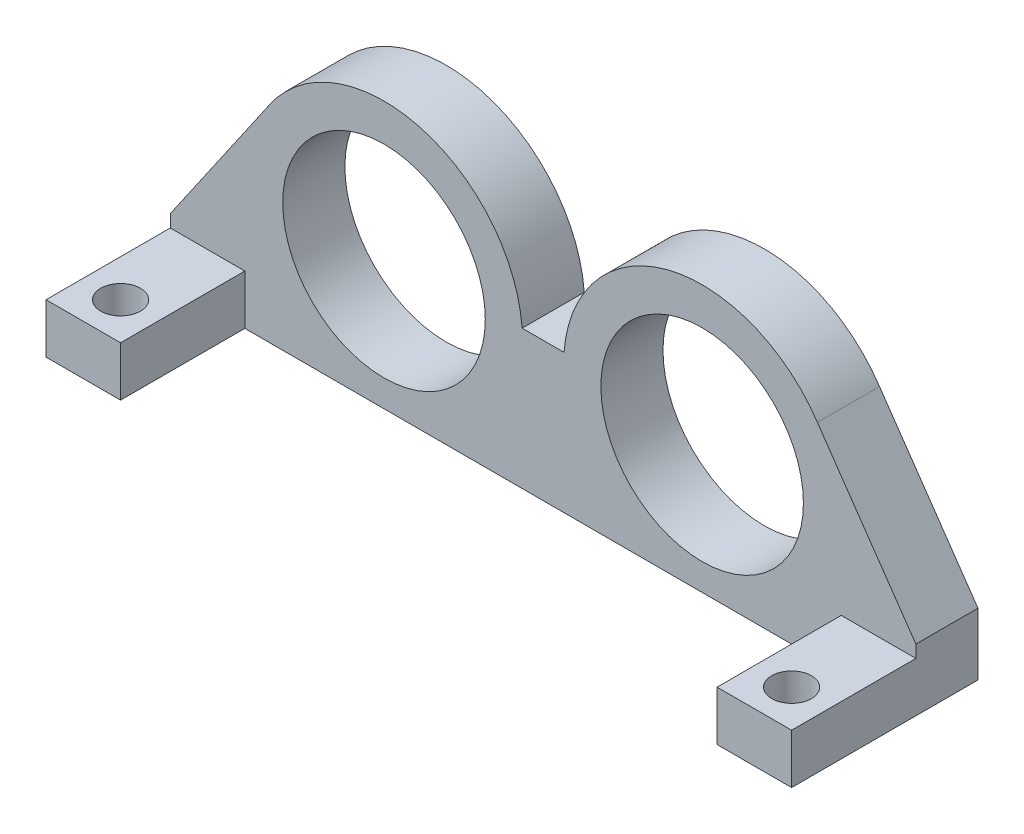
ISO-10303-21;
HEADER;
FILE_DESCRIPTION(('STEP AP214'),'2;1');
FILE_NAME('part.step','',(''),(''),'','','');
FILE_SCHEMA(('AUTOMOTIVE_DESIGN { 1 0 10303 214 1 1 1 1 }'));
ENDSEC;
DATA;
#1=APPLICATION_CONTEXT('core data for automotive mechanical design processes');
#2=APPLICATION_PROTOCOL_DEFINITION('international standard','automotive_design',2000,#1);
#3=PRODUCT_CONTEXT('',#1,'mechanical');
#4=PRODUCT('Part','Part','',(#3));
#5=PRODUCT_RELATED_PRODUCT_CATEGORY('part','',(#4));
#6=PRODUCT_DEFINITION_FORMATION('','',#4);
#7=PRODUCT_DEFINITION_CONTEXT('part definition',#1,'design');
#8=PRODUCT_DEFINITION('design','',#6,#7);
#9=PRODUCT_DEFINITION_SHAPE('','',#8);
#10=(LENGTH_UNIT() NAMED_UNIT(*) SI_UNIT(.MILLI.,.METRE.));
#11=(NAMED_UNIT(*) PLANE_ANGLE_UNIT() SI_UNIT($,.RADIAN.));
#12=(NAMED_UNIT(*) SI_UNIT($,.STERADIAN.) SOLID_ANGLE_UNIT());
#13=UNCERTAINTY_MEASURE_WITH_UNIT(LENGTH_MEASURE(1.E-05),#10,'distance_accuracy_value','');
#14=(GEOMETRIC_REPRESENTATION_CONTEXT(3) GLOBAL_UNCERTAINTY_ASSIGNED_CONTEXT((#13)) GLOBAL_UNIT_ASSIGNED_CONTEXT((#10,
#11,#12)) REPRESENTATION_CONTEXT('',''));
#15=CARTESIAN_POINT('',(0.,0.,0.));
#16=DIRECTION('',(0.,0.,1.));
#17=DIRECTION('',(1.,0.,0.));
#18=AXIS2_PLACEMENT_3D('',#15,#16,#17);
#19=CARTESIAN_POINT('',(-12.8,10.2990572190135,5.));
#20=DIRECTION('',(0.,0.,-1.));
#21=DIRECTION('',(-1.,0.,0.));
#22=AXIS2_PLACEMENT_3D('',#19,#20,#21);
#23=PLANE('',#22);
#24=CARTESIAN_POINT('',(-12.8,10.2990572190135,5.));
#25=DIRECTION('',(0.,0.,1.));
#26=DIRECTION('',(1.,0.,0.));
#27=AXIS2_PLACEMENT_3D('',#24,#25,#26);
#28=CIRCLE('',#27,8.15);
#29=CARTESIAN_POINT('',(-4.65,10.2990572190135,5.));
#30=VERTEX_POINT('',#29);
#31=EDGE_CURVE('E205',#30,#30,#28,.T.);
#32=ORIENTED_EDGE('',*,*,#31,.F.);
#33=EDGE_LOOP('',(#32));
#34=FACE_BOUND('',#33,.T.);
#35=CARTESIAN_POINT('',(12.8,10.2990572190135,5.));
#36=DIRECTION('',(0.,0.,1.));
#37=DIRECTION('',(-1.,0.,0.));
#38=AXIS2_PLACEMENT_3D('',#35,#36,#37);
#39=CIRCLE('',#38,8.15);
#40=CARTESIAN_POINT('',(4.65,10.2990572190135,5.));
#41=VERTEX_POINT('',#40);
#42=EDGE_CURVE('E199',#41,#41,#39,.T.);
#43=ORIENTED_EDGE('',*,*,#42,.F.);
#44=EDGE_LOOP('',(#43));
#45=FACE_BOUND('',#44,.T.);
#46=DIRECTION('',(-1.,0.,0.));
#47=VECTOR('',#46,1.);
#48=CARTESIAN_POINT('',(30.,4.,5.));
#49=LINE('',#48,#47);
#50=CARTESIAN_POINT('',(30.,4.,5.));
#51=VERTEX_POINT('',#50);
#52=CARTESIAN_POINT('',(24.,4.,5.));
#53=VERTEX_POINT('',#52);
#54=EDGE_CURVE('E159',#51,#53,#49,.T.);
#55=ORIENTED_EDGE('',*,*,#54,.F.);
#56=DIRECTION('',(0.,1.,0.));
#57=VECTOR('',#56,1.);
#58=CARTESIAN_POINT('',(30.,0.,5.));
#59=LINE('',#58,#57);
#60=CARTESIAN_POINT('',(30.,5.,5.));
#61=VERTEX_POINT('',#60);
#62=EDGE_CURVE('E215',#51,#61,#59,.T.);
#63=ORIENTED_EDGE('',*,*,#62,.T.);
#64=DIRECTION('',(-0.56786014343892,0.823125055804724,0.));
#65=VECTOR('',#64,1.);
#66=CARTESIAN_POINT('',(30.,5.,5.));
#67=LINE('',#66,#65);
#68=CARTESIAN_POINT('',(22.0760551043822,16.4859224753824,5.));
#69=VERTEX_POINT('',#68);
#70=EDGE_CURVE('E217',#61,#69,#67,.T.);
#71=ORIENTED_EDGE('',*,*,#70,.T.);
#72=CARTESIAN_POINT('',(12.8,10.2990572190135,5.));
#73=DIRECTION('',(0.,0.,1.));
#74=DIRECTION('',(1.,0.,0.));
#75=AXIS2_PLACEMENT_3D('',#72,#73,#74);
#76=CIRCLE('',#75,11.15);
#77=CARTESIAN_POINT('',(1.68444229891298,11.1747723518079,5.));
#78=VERTEX_POINT('',#77);
#79=EDGE_CURVE('E219',#69,#78,#76,.T.);
#80=ORIENTED_EDGE('',*,*,#79,.T.);
#81=DIRECTION('',(-1.,0.,0.));
#82=VECTOR('',#81,1.);
#83=CARTESIAN_POINT('',(-1.68444229891298,11.1747723518079,5.));
#84=LINE('',#83,#82);
#85=CARTESIAN_POINT('',(-1.68444229891298,11.1747723518079,5.));
#86=VERTEX_POINT('',#85);
#87=EDGE_CURVE('E221',#78,#86,#84,.T.);
#88=ORIENTED_EDGE('',*,*,#87,.T.);
#89=CARTESIAN_POINT('',(-12.8,10.2990572190135,5.));
#90=DIRECTION('',(0.,0.,1.));
#91=DIRECTION('',(-1.,0.,0.));
#92=AXIS2_PLACEMENT_3D('',#89,#90,#91);
#93=CIRCLE('',#92,11.15);
#94=CARTESIAN_POINT('',(-22.0760551043822,16.4859224753824,5.));
#95=VERTEX_POINT('',#94);
#96=EDGE_CURVE('E223',#86,#95,#93,.T.);
#97=ORIENTED_EDGE('',*,*,#96,.T.);
#98=DIRECTION('',(-0.56786014343892,-0.823125055804724,0.));
#99=VECTOR('',#98,1.);
#100=CARTESIAN_POINT('',(-30.,4.99999999999999,5.));
#101=LINE('',#100,#99);
#102=CARTESIAN_POINT('',(-30.,4.99999999999999,5.));
#103=VERTEX_POINT('',#102);
#104=EDGE_CURVE('E225',#95,#103,#101,.T.);
#105=ORIENTED_EDGE('',*,*,#104,.T.);
#106=DIRECTION('',(0.,-1.,0.));
#107=VECTOR('',#106,1.);
#108=CARTESIAN_POINT('',(-30.,0.,5.));
#109=LINE('',#108,#107);
#110=CARTESIAN_POINT('',(-30.,3.99999999999999,5.));
#111=VERTEX_POINT('',#110);
#112=EDGE_CURVE('E211',#103,#111,#109,.T.);
#113=ORIENTED_EDGE('',*,*,#112,.T.);
#114=DIRECTION('',(-1.,0.,0.));
#115=VECTOR('',#114,1.);
#116=CARTESIAN_POINT('',(-30.,3.99999999999999,5.));
#117=LINE('',#116,#115);
#118=CARTESIAN_POINT('',(-24.,3.99999999999999,5.));
#119=VERTEX_POINT('',#118);
#120=EDGE_CURVE('E179',#119,#111,#117,.T.);
#121=ORIENTED_EDGE('',*,*,#120,.F.);
#122=DIRECTION('',(0.,1.,0.));
#123=VECTOR('',#122,1.);
#124=CARTESIAN_POINT('',(-24.,0.,5.));
#125=LINE('',#124,#123);
#126=CARTESIAN_POINT('',(-24.,0.,5.));
#127=VERTEX_POINT('',#126);
#128=EDGE_CURVE('E174',#127,#119,#125,.T.);
#129=ORIENTED_EDGE('',*,*,#128,.F.);
#130=DIRECTION('',(1.,0.,0.));
#131=VECTOR('',#130,1.);
#132=CARTESIAN_POINT('',(30.,0.,5.));
#133=LINE('',#132,#131);
#134=CARTESIAN_POINT('',(24.,0.,5.));
#135=VERTEX_POINT('',#134);
#136=EDGE_CURVE('E56',#127,#135,#133,.T.);
#137=ORIENTED_EDGE('',*,*,#136,.T.);
#138=DIRECTION('',(0.,-1.,0.));
#139=VECTOR('',#138,1.);
#140=CARTESIAN_POINT('',(24.,0.,5.));
#141=LINE('',#140,#139);
#142=EDGE_CURVE('E51',#53,#135,#141,.T.);
#143=ORIENTED_EDGE('',*,*,#142,.F.);
#144=EDGE_LOOP('',(#55,#63,#71,#80,#88,#97,#105,#113,#121,#129,#137,#143));
#145=FACE_BOUND('',#144,.T.);
#146=ADVANCED_FACE('F36',(#34,#45,#145),#23,.F.);
#147=CARTESIAN_POINT('',(-12.8,10.2990572190135,0.));
#148=DIRECTION('',(0.,0.,-1.));
#149=DIRECTION('',(-1.,0.,0.));
#150=AXIS2_PLACEMENT_3D('',#147,#148,#149);
#151=PLANE('',#150);
#152=CARTESIAN_POINT('',(-12.8,10.2990572190135,0.));
#153=DIRECTION('',(0.,0.,1.));
#154=DIRECTION('',(1.,0.,0.));
#155=AXIS2_PLACEMENT_3D('',#152,#153,#154);
#156=CIRCLE('',#155,8.15);
#157=CARTESIAN_POINT('',(-4.65,10.2990572190135,0.));
#158=VERTEX_POINT('',#157);
#159=EDGE_CURVE('E202',#158,#158,#156,.T.);
#160=ORIENTED_EDGE('',*,*,#159,.T.);
#161=EDGE_LOOP('',(#160));
#162=FACE_BOUND('',#161,.T.);
#163=DIRECTION('',(0.,-1.,0.));
#164=VECTOR('',#163,1.);
#165=CARTESIAN_POINT('',(-30.,0.,0.));
#166=LINE('',#165,#164);
#167=CARTESIAN_POINT('',(-30.,4.99999999999999,0.));
#168=VERTEX_POINT('',#167);
#169=CARTESIAN_POINT('',(-30.,0.,0.));
#170=VERTEX_POINT('',#169);
#171=EDGE_CURVE('E208',#168,#170,#166,.T.);
#172=ORIENTED_EDGE('',*,*,#171,.F.);
#173=DIRECTION('',(-0.56786014343892,-0.823125055804724,0.));
#174=VECTOR('',#173,1.);
#175=CARTESIAN_POINT('',(-30.,4.99999999999999,0.));
#176=LINE('',#175,#174);
#177=CARTESIAN_POINT('',(-22.0760551043822,16.4859224753824,0.));
#178=VERTEX_POINT('',#177);
#179=EDGE_CURVE('E213',#178,#168,#176,.T.);
#180=ORIENTED_EDGE('',*,*,#179,.F.);
#181=CARTESIAN_POINT('',(-12.8,10.2990572190135,0.));
#182=DIRECTION('',(0.,0.,1.));
#183=DIRECTION('',(-1.,0.,0.));
#184=AXIS2_PLACEMENT_3D('',#181,#182,#183);
#185=CIRCLE('',#184,11.15);
#186=CARTESIAN_POINT('',(-1.68444229891298,11.1747723518079,0.));
#187=VERTEX_POINT('',#186);
#188=EDGE_CURVE('E239',#187,#178,#185,.T.);
#189=ORIENTED_EDGE('',*,*,#188,.F.);
#190=DIRECTION('',(-1.,0.,0.));
#191=VECTOR('',#190,1.);
#192=CARTESIAN_POINT('',(-1.68444229891298,11.1747723518079,0.));
#193=LINE('',#192,#191);
#194=CARTESIAN_POINT('',(1.68444229891298,11.1747723518079,0.));
#195=VERTEX_POINT('',#194);
#196=EDGE_CURVE('E237',#195,#187,#193,.T.);
#197=ORIENTED_EDGE('',*,*,#196,.F.);
#198=CARTESIAN_POINT('',(12.8,10.2990572190135,0.));
#199=DIRECTION('',(0.,0.,1.));
#200=DIRECTION('',(1.,0.,0.));
#201=AXIS2_PLACEMENT_3D('',#198,#199,#200);
#202=CIRCLE('',#201,11.15);
#203=CARTESIAN_POINT('',(22.0760551043822,16.4859224753824,0.));
#204=VERTEX_POINT('',#203);
#205=EDGE_CURVE('E235',#204,#195,#202,.T.);
#206=ORIENTED_EDGE('',*,*,#205,.F.);
#207=DIRECTION('',(-0.56786014343892,0.823125055804724,0.));
#208=VECTOR('',#207,1.);
#209=CARTESIAN_POINT('',(30.,5.,0.));
#210=LINE('',#209,#208);
#211=CARTESIAN_POINT('',(30.,5.,0.));
#212=VERTEX_POINT('',#211);
#213=EDGE_CURVE('E233',#212,#204,#210,.T.);
#214=ORIENTED_EDGE('',*,*,#213,.F.);
#215=DIRECTION('',(0.,1.,0.));
#216=VECTOR('',#215,1.);
#217=CARTESIAN_POINT('',(30.,0.,0.));
#218=LINE('',#217,#216);
#219=CARTESIAN_POINT('',(30.,0.,0.));
#220=VERTEX_POINT('',#219);
#221=EDGE_CURVE('E231',#220,#212,#218,.T.);
#222=ORIENTED_EDGE('',*,*,#221,.F.);
#223=DIRECTION('',(1.,0.,0.));
#224=VECTOR('',#223,1.);
#225=CARTESIAN_POINT('',(30.,0.,0.));
#226=LINE('',#225,#224);
#227=EDGE_CURVE('E141',#170,#220,#226,.T.);
#228=ORIENTED_EDGE('',*,*,#227,.F.);
#229=EDGE_LOOP('',(#172,#180,#189,#197,#206,#214,#222,#228));
#230=FACE_BOUND('',#229,.T.);
#231=CARTESIAN_POINT('',(12.8,10.2990572190135,0.));
#232=DIRECTION('',(0.,0.,1.));
#233=DIRECTION('',(-1.,0.,0.));
#234=AXIS2_PLACEMENT_3D('',#231,#232,#233);
#235=CIRCLE('',#234,8.15);
#236=CARTESIAN_POINT('',(4.65,10.2990572190135,0.));
#237=VERTEX_POINT('',#236);
#238=EDGE_CURVE('E198',#237,#237,#235,.T.);
#239=ORIENTED_EDGE('',*,*,#238,.T.);
#240=EDGE_LOOP('',(#239));
#241=FACE_BOUND('',#240,.T.);
#242=ADVANCED_FACE('F266',(#162,#230,#241),#151,.T.);
#243=CARTESIAN_POINT('',(-30.,0.,5.));
#244=DIRECTION('',(1.,0.,0.));
#245=DIRECTION('',(0.,1.,0.));
#246=AXIS2_PLACEMENT_3D('',#243,#244,#245);
#247=PLANE('',#246);
#248=ORIENTED_EDGE('',*,*,#171,.T.);
#249=DIRECTION('',(0.,0.,-1.));
#250=VECTOR('',#249,1.);
#251=CARTESIAN_POINT('',(-30.,0.,5.));
#252=LINE('',#251,#250);
#253=CARTESIAN_POINT('',(-30.,0.,15.));
#254=VERTEX_POINT('',#253);
#255=EDGE_CURVE('E11',#254,#170,#252,.T.);
#256=ORIENTED_EDGE('',*,*,#255,.F.);
#257=DIRECTION('',(0.,-1.,0.));
#258=VECTOR('',#257,1.);
#259=CARTESIAN_POINT('',(-30.,0.,15.));
#260=LINE('',#259,#258);
#261=CARTESIAN_POINT('',(-30.,3.99999999999999,15.));
#262=VERTEX_POINT('',#261);
#263=EDGE_CURVE('E175',#262,#254,#260,.T.);
#264=ORIENTED_EDGE('',*,*,#263,.F.);
#265=DIRECTION('',(0.,0.,-1.));
#266=VECTOR('',#265,1.);
#267=CARTESIAN_POINT('',(-30.,3.99999999999999,15.));
#268=LINE('',#267,#266);
#269=EDGE_CURVE('E185',#262,#111,#268,.T.);
#270=ORIENTED_EDGE('',*,*,#269,.T.);
#271=ORIENTED_EDGE('',*,*,#112,.F.);
#272=DIRECTION('',(0.,0.,-1.));
#273=VECTOR('',#272,1.);
#274=CARTESIAN_POINT('',(-30.,4.99999999999999,5.));
#275=LINE('',#274,#273);
#276=EDGE_CURVE('E227',#103,#168,#275,.T.);
#277=ORIENTED_EDGE('',*,*,#276,.T.);
#278=EDGE_LOOP('',(#248,#256,#264,#270,#271,#277));
#279=FACE_BOUND('',#278,.T.);
#280=ADVANCED_FACE('F38',(#279),#247,.F.);
#281=CARTESIAN_POINT('',(30.,0.,5.));
#282=DIRECTION('',(0.,1.,0.));
#283=DIRECTION('',(-1.,0.,0.));
#284=AXIS2_PLACEMENT_3D('',#281,#282,#283);
#285=PLANE('',#284);
#286=CARTESIAN_POINT('',(-27.,0.,12.));
#287=DIRECTION('',(0.,1.,0.));
#288=DIRECTION('',(-1.,0.,0.));
#289=AXIS2_PLACEMENT_3D('',#286,#287,#288);
#290=CIRCLE('',#289,1.6);
#291=CARTESIAN_POINT('',(-28.6,0.,12.));
#292=VERTEX_POINT('',#291);
#293=EDGE_CURVE('E162',#292,#292,#290,.T.);
#294=ORIENTED_EDGE('',*,*,#293,.T.);
#295=EDGE_LOOP('',(#294));
#296=FACE_BOUND('',#295,.T.);
#297=CARTESIAN_POINT('',(27.,0.,12.));
#298=DIRECTION('',(0.,1.,0.));
#299=DIRECTION('',(-1.,0.,0.));
#300=AXIS2_PLACEMENT_3D('',#297,#298,#299);
#301=CIRCLE('',#300,1.6);
#302=CARTESIAN_POINT('',(25.4,0.,12.));
#303=VERTEX_POINT('',#302);
#304=EDGE_CURVE('E363',#303,#303,#301,.T.);
#305=ORIENTED_EDGE('',*,*,#304,.T.);
#306=EDGE_LOOP('',(#305));
#307=FACE_BOUND('',#306,.T.);
#308=ORIENTED_EDGE('',*,*,#227,.T.);
#309=DIRECTION('',(0.,0.,-1.));
#310=VECTOR('',#309,1.);
#311=CARTESIAN_POINT('',(30.,0.,5.));
#312=LINE('',#311,#310);
#313=CARTESIAN_POINT('',(30.,0.,15.));
#314=VERTEX_POINT('',#313);
#315=EDGE_CURVE('E44',#314,#220,#312,.T.);
#316=ORIENTED_EDGE('',*,*,#315,.F.);
#317=DIRECTION('',(1.,0.,0.));
#318=VECTOR('',#317,1.);
#319=CARTESIAN_POINT('',(30.,0.,15.));
#320=LINE('',#319,#318);
#321=CARTESIAN_POINT('',(24.,0.,15.));
#322=VERTEX_POINT('',#321);
#323=EDGE_CURVE('E140',#322,#314,#320,.T.);
#324=ORIENTED_EDGE('',*,*,#323,.F.);
#325=DIRECTION('',(0.,0.,-1.));
#326=VECTOR('',#325,1.);
#327=CARTESIAN_POINT('',(24.,0.,15.));
#328=LINE('',#327,#326);
#329=EDGE_CURVE('E167',#322,#135,#328,.T.);
#330=ORIENTED_EDGE('',*,*,#329,.T.);
#331=ORIENTED_EDGE('',*,*,#136,.F.);
#332=DIRECTION('',(0.,0.,-1.));
#333=VECTOR('',#332,1.);
#334=CARTESIAN_POINT('',(-24.,0.,15.));
#335=LINE('',#334,#333);
#336=CARTESIAN_POINT('',(-24.,0.,15.));
#337=VERTEX_POINT('',#336);
#338=EDGE_CURVE('E195',#337,#127,#335,.T.);
#339=ORIENTED_EDGE('',*,*,#338,.F.);
#340=DIRECTION('',(1.,0.,0.));
#341=VECTOR('',#340,1.);
#342=CARTESIAN_POINT('',(-30.,0.,15.));
#343=LINE('',#342,#341);
#344=EDGE_CURVE('E178',#254,#337,#343,.T.);
#345=ORIENTED_EDGE('',*,*,#344,.F.);
#346=ORIENTED_EDGE('',*,*,#255,.T.);
#347=EDGE_LOOP('',(#308,#316,#324,#330,#331,#339,#345,#346));
#348=FACE_BOUND('',#347,.T.);
#349=ADVANCED_FACE('F137',(#296,#307,#348),#285,.F.);
#350=CARTESIAN_POINT('',(30.,0.,5.));
#351=DIRECTION('',(-1.,0.,0.));
#352=DIRECTION('',(0.,-1.,0.));
#353=AXIS2_PLACEMENT_3D('',#350,#351,#352);
#354=PLANE('',#353);
#355=ORIENTED_EDGE('',*,*,#221,.T.);
#356=DIRECTION('',(0.,0.,-1.));
#357=VECTOR('',#356,1.);
#358=CARTESIAN_POINT('',(30.,5.,5.));
#359=LINE('',#358,#357);
#360=EDGE_CURVE('E144',#61,#212,#359,.T.);
#361=ORIENTED_EDGE('',*,*,#360,.F.);
#362=ORIENTED_EDGE('',*,*,#62,.F.);
#363=DIRECTION('',(0.,0.,-1.));
#364=VECTOR('',#363,1.);
#365=CARTESIAN_POINT('',(30.,4.,15.));
#366=LINE('',#365,#364);
#367=CARTESIAN_POINT('',(30.,4.,15.));
#368=VERTEX_POINT('',#367);
#369=EDGE_CURVE('E149',#368,#51,#366,.T.);
#370=ORIENTED_EDGE('',*,*,#369,.F.);
#371=DIRECTION('',(0.,1.,0.));
#372=VECTOR('',#371,1.);
#373=CARTESIAN_POINT('',(30.,0.,15.));
#374=LINE('',#373,#372);
#375=EDGE_CURVE('E146',#314,#368,#374,.T.);
#376=ORIENTED_EDGE('',*,*,#375,.F.);
#377=ORIENTED_EDGE('',*,*,#315,.T.);
#378=EDGE_LOOP('',(#355,#361,#362,#370,#376,#377));
#379=FACE_BOUND('',#378,.T.);
#380=ADVANCED_FACE('F147',(#379),#354,.F.);
#381=CARTESIAN_POINT('',(30.,5.,5.));
#382=DIRECTION('',(-0.823125055804724,-0.56786014343892,0.));
#383=DIRECTION('',(0.56786014343892,-0.823125055804724,0.));
#384=AXIS2_PLACEMENT_3D('',#381,#382,#383);
#385=PLANE('',#384);
#386=ORIENTED_EDGE('',*,*,#213,.T.);
#387=DIRECTION('',(0.,0.,-1.));
#388=VECTOR('',#387,1.);
#389=CARTESIAN_POINT('',(22.0760551043822,16.4859224753824,5.));
#390=LINE('',#389,#388);
#391=EDGE_CURVE('E253',#69,#204,#390,.T.);
#392=ORIENTED_EDGE('',*,*,#391,.F.);
#393=ORIENTED_EDGE('',*,*,#70,.F.);
#394=ORIENTED_EDGE('',*,*,#360,.T.);
#395=EDGE_LOOP('',(#386,#392,#393,#394));
#396=FACE_BOUND('',#395,.T.);
#397=ADVANCED_FACE('F261',(#396),#385,.F.);
#398=CARTESIAN_POINT('',(12.8,10.2990572190135,5.));
#399=DIRECTION('',(0.,0.,-1.));
#400=DIRECTION('',(-1.,0.,0.));
#401=AXIS2_PLACEMENT_3D('',#398,#399,#400);
#402=CYLINDRICAL_SURFACE('',#401,11.15);
#403=ORIENTED_EDGE('',*,*,#205,.T.);
#404=DIRECTION('',(0.,0.,-1.));
#405=VECTOR('',#404,1.);
#406=CARTESIAN_POINT('',(1.68444229891298,11.1747723518079,5.));
#407=LINE('',#406,#405);
#408=EDGE_CURVE('E250',#78,#195,#407,.T.);
#409=ORIENTED_EDGE('',*,*,#408,.F.);
#410=ORIENTED_EDGE('',*,*,#79,.F.);
#411=ORIENTED_EDGE('',*,*,#391,.T.);
#412=EDGE_LOOP('',(#403,#409,#410,#411));
#413=FACE_BOUND('',#412,.T.);
#414=ADVANCED_FACE('F272',(#413),#402,.T.);
#415=CARTESIAN_POINT('',(-1.68444229891298,11.1747723518079,5.));
#416=DIRECTION('',(0.,-1.,0.));
#417=DIRECTION('',(0.,0.,-1.));
#418=AXIS2_PLACEMENT_3D('',#415,#416,#417);
#419=PLANE('',#418);
#420=ORIENTED_EDGE('',*,*,#196,.T.);
#421=DIRECTION('',(0.,0.,-1.));
#422=VECTOR('',#421,1.);
#423=CARTESIAN_POINT('',(-1.68444229891298,11.1747723518079,5.));
#424=LINE('',#423,#422);
#425=EDGE_CURVE('E247',#86,#187,#424,.T.);
#426=ORIENTED_EDGE('',*,*,#425,.F.);
#427=ORIENTED_EDGE('',*,*,#87,.F.);
#428=ORIENTED_EDGE('',*,*,#408,.T.);
#429=EDGE_LOOP('',(#420,#426,#427,#428));
#430=FACE_BOUND('',#429,.T.);
#431=ADVANCED_FACE('F276',(#430),#419,.F.);
#432=CARTESIAN_POINT('',(-12.8,10.2990572190135,5.));
#433=DIRECTION('',(0.,0.,-1.));
#434=DIRECTION('',(-1.,0.,0.));
#435=AXIS2_PLACEMENT_3D('',#432,#433,#434);
#436=CYLINDRICAL_SURFACE('',#435,11.15);
#437=ORIENTED_EDGE('',*,*,#188,.T.);
#438=DIRECTION('',(0.,0.,-1.));
#439=VECTOR('',#438,1.);
#440=CARTESIAN_POINT('',(-22.0760551043822,16.4859224753824,5.));
#441=LINE('',#440,#439);
#442=EDGE_CURVE('E244',#95,#178,#441,.T.);
#443=ORIENTED_EDGE('',*,*,#442,.F.);
#444=ORIENTED_EDGE('',*,*,#96,.F.);
#445=ORIENTED_EDGE('',*,*,#425,.T.);
#446=EDGE_LOOP('',(#437,#443,#444,#445));
#447=FACE_BOUND('',#446,.T.);
#448=ADVANCED_FACE('F304',(#447),#436,.T.);
#449=CARTESIAN_POINT('',(-30.,4.99999999999999,5.));
#450=DIRECTION('',(0.823125055804724,-0.56786014343892,0.));
#451=DIRECTION('',(0.56786014343892,0.823125055804724,0.));
#452=AXIS2_PLACEMENT_3D('',#449,#450,#451);
#453=PLANE('',#452);
#454=ORIENTED_EDGE('',*,*,#179,.T.);
#455=ORIENTED_EDGE('',*,*,#276,.F.);
#456=ORIENTED_EDGE('',*,*,#104,.F.);
#457=ORIENTED_EDGE('',*,*,#442,.T.);
#458=EDGE_LOOP('',(#454,#455,#456,#457));
#459=FACE_BOUND('',#458,.T.);
#460=ADVANCED_FACE('F301',(#459),#453,.F.);
#461=CARTESIAN_POINT('',(-12.8,10.2990572190135,5.));
#462=DIRECTION('',(0.,0.,-1.));
#463=DIRECTION('',(-1.,0.,0.));
#464=AXIS2_PLACEMENT_3D('',#461,#462,#463);
#465=CYLINDRICAL_SURFACE('',#464,8.15);
#466=ORIENTED_EDGE('',*,*,#31,.T.);
#467=EDGE_LOOP('',(#466));
#468=FACE_BOUND('',#467,.T.);
#469=ORIENTED_EDGE('',*,*,#159,.F.);
#470=EDGE_LOOP('',(#469));
#471=FACE_BOUND('',#470,.T.);
#472=ADVANCED_FACE('F311',(#468,#471),#465,.F.);
#473=CARTESIAN_POINT('',(12.8,10.2990572190135,5.));
#474=DIRECTION('',(0.,0.,-1.));
#475=DIRECTION('',(-1.,0.,0.));
#476=AXIS2_PLACEMENT_3D('',#473,#474,#475);
#477=CYLINDRICAL_SURFACE('',#476,8.15);
#478=ORIENTED_EDGE('',*,*,#42,.T.);
#479=EDGE_LOOP('',(#478));
#480=FACE_BOUND('',#479,.T.);
#481=ORIENTED_EDGE('',*,*,#238,.F.);
#482=EDGE_LOOP('',(#481));
#483=FACE_BOUND('',#482,.T.);
#484=ADVANCED_FACE('F327',(#480,#483),#477,.F.);
#485=CARTESIAN_POINT('',(-24.,0.,15.));
#486=DIRECTION('',(-1.,0.,0.));
#487=DIRECTION('',(0.,0.,1.));
#488=AXIS2_PLACEMENT_3D('',#485,#486,#487);
#489=PLANE('',#488);
#490=ORIENTED_EDGE('',*,*,#128,.T.);
#491=DIRECTION('',(0.,0.,-1.));
#492=VECTOR('',#491,1.);
#493=CARTESIAN_POINT('',(-24.,3.99999999999999,15.));
#494=LINE('',#493,#492);
#495=CARTESIAN_POINT('',(-24.,3.99999999999999,15.));
#496=VERTEX_POINT('',#495);
#497=EDGE_CURVE('E192',#496,#119,#494,.T.);
#498=ORIENTED_EDGE('',*,*,#497,.F.);
#499=DIRECTION('',(0.,1.,0.));
#500=VECTOR('',#499,1.);
#501=CARTESIAN_POINT('',(-24.,0.,15.));
#502=LINE('',#501,#500);
#503=EDGE_CURVE('E181',#337,#496,#502,.T.);
#504=ORIENTED_EDGE('',*,*,#503,.F.);
#505=ORIENTED_EDGE('',*,*,#338,.T.);
#506=EDGE_LOOP('',(#490,#498,#504,#505));
#507=FACE_BOUND('',#506,.T.);
#508=ADVANCED_FACE('F289',(#507),#489,.F.);
#509=CARTESIAN_POINT('',(-30.,3.99999999999999,15.));
#510=DIRECTION('',(0.,-1.,0.));
#511=DIRECTION('',(0.,0.,-1.));
#512=AXIS2_PLACEMENT_3D('',#509,#510,#511);
#513=PLANE('',#512);
#514=CARTESIAN_POINT('',(-27.,3.99999999999999,12.));
#515=DIRECTION('',(0.,1.,0.));
#516=DIRECTION('',(0.,0.,1.));
#517=AXIS2_PLACEMENT_3D('',#514,#515,#516);
#518=CIRCLE('',#517,1.6);
#519=CARTESIAN_POINT('',(-27.,3.99999999999999,13.6));
#520=VERTEX_POINT('',#519);
#521=EDGE_CURVE('E359',#520,#520,#518,.T.);
#522=ORIENTED_EDGE('',*,*,#521,.F.);
#523=EDGE_LOOP('',(#522));
#524=FACE_BOUND('',#523,.T.);
#525=ORIENTED_EDGE('',*,*,#120,.T.);
#526=ORIENTED_EDGE('',*,*,#269,.F.);
#527=DIRECTION('',(-1.,0.,0.));
#528=VECTOR('',#527,1.);
#529=CARTESIAN_POINT('',(-30.,3.99999999999999,15.));
#530=LINE('',#529,#528);
#531=EDGE_CURVE('E183',#496,#262,#530,.T.);
#532=ORIENTED_EDGE('',*,*,#531,.F.);
#533=ORIENTED_EDGE('',*,*,#497,.T.);
#534=EDGE_LOOP('',(#525,#526,#532,#533));
#535=FACE_BOUND('',#534,.T.);
#536=ADVANCED_FACE('F334',(#524,#535),#513,.F.);
#537=CARTESIAN_POINT('',(0.,0.,15.));
#538=DIRECTION('',(0.,0.,-1.));
#539=DIRECTION('',(-1.,0.,0.));
#540=AXIS2_PLACEMENT_3D('',#537,#538,#539);
#541=PLANE('',#540);
#542=ORIENTED_EDGE('',*,*,#263,.T.);
#543=ORIENTED_EDGE('',*,*,#344,.T.);
#544=ORIENTED_EDGE('',*,*,#503,.T.);
#545=ORIENTED_EDGE('',*,*,#531,.T.);
#546=EDGE_LOOP('',(#542,#543,#544,#545));
#547=FACE_BOUND('',#546,.T.);
#548=ADVANCED_FACE('F293',(#547),#541,.F.);
#549=CARTESIAN_POINT('',(30.,4.,15.));
#550=DIRECTION('',(0.,-1.,0.));
#551=DIRECTION('',(1.,0.,0.));
#552=AXIS2_PLACEMENT_3D('',#549,#550,#551);
#553=PLANE('',#552);
#554=CARTESIAN_POINT('',(27.,3.99999999999999,12.));
#555=DIRECTION('',(0.,1.,0.));
#556=DIRECTION('',(0.,0.,1.));
#557=AXIS2_PLACEMENT_3D('',#554,#555,#556);
#558=CIRCLE('',#557,1.6);
#559=CARTESIAN_POINT('',(27.,3.99999999999999,13.6));
#560=VERTEX_POINT('',#559);
#561=EDGE_CURVE('E367',#560,#560,#558,.T.);
#562=ORIENTED_EDGE('',*,*,#561,.F.);
#563=EDGE_LOOP('',(#562));
#564=FACE_BOUND('',#563,.T.);
#565=ORIENTED_EDGE('',*,*,#54,.T.);
#566=DIRECTION('',(0.,0.,-1.));
#567=VECTOR('',#566,1.);
#568=CARTESIAN_POINT('',(24.,4.,15.));
#569=LINE('',#568,#567);
#570=CARTESIAN_POINT('',(24.,4.,15.));
#571=VERTEX_POINT('',#570);
#572=EDGE_CURVE('E170',#571,#53,#569,.T.);
#573=ORIENTED_EDGE('',*,*,#572,.F.);
#574=DIRECTION('',(-1.,0.,0.));
#575=VECTOR('',#574,1.);
#576=CARTESIAN_POINT('',(30.,4.,15.));
#577=LINE('',#576,#575);
#578=EDGE_CURVE('E152',#368,#571,#577,.T.);
#579=ORIENTED_EDGE('',*,*,#578,.F.);
#580=ORIENTED_EDGE('',*,*,#369,.T.);
#581=EDGE_LOOP('',(#565,#573,#579,#580));
#582=FACE_BOUND('',#581,.T.);
#583=ADVANCED_FACE('F282',(#564,#582),#553,.F.);
#584=CARTESIAN_POINT('',(24.,0.,15.));
#585=DIRECTION('',(1.,0.,0.));
#586=DIRECTION('',(0.,0.,-1.));
#587=AXIS2_PLACEMENT_3D('',#584,#585,#586);
#588=PLANE('',#587);
#589=ORIENTED_EDGE('',*,*,#142,.T.);
#590=ORIENTED_EDGE('',*,*,#329,.F.);
#591=DIRECTION('',(0.,-1.,0.));
#592=VECTOR('',#591,1.);
#593=CARTESIAN_POINT('',(24.,0.,15.));
#594=LINE('',#593,#592);
#595=EDGE_CURVE('E156',#571,#322,#594,.T.);
#596=ORIENTED_EDGE('',*,*,#595,.F.);
#597=ORIENTED_EDGE('',*,*,#572,.T.);
#598=EDGE_LOOP('',(#589,#590,#596,#597));
#599=FACE_BOUND('',#598,.T.);
#600=ADVANCED_FACE('F284',(#599),#588,.F.);
#601=CARTESIAN_POINT('',(0.,0.,15.));
#602=DIRECTION('',(0.,0.,-1.));
#603=DIRECTION('',(-1.,0.,0.));
#604=AXIS2_PLACEMENT_3D('',#601,#602,#603);
#605=PLANE('',#604);
#606=ORIENTED_EDGE('',*,*,#323,.T.);
#607=ORIENTED_EDGE('',*,*,#375,.T.);
#608=ORIENTED_EDGE('',*,*,#578,.T.);
#609=ORIENTED_EDGE('',*,*,#595,.T.);
#610=EDGE_LOOP('',(#606,#607,#608,#609));
#611=FACE_BOUND('',#610,.T.);
#612=ADVANCED_FACE('F154',(#611),#605,.F.);
#613=CARTESIAN_POINT('',(27.,-6.00000000000001,12.));
#614=DIRECTION('',(0.,1.,0.));
#615=DIRECTION('',(0.,0.,1.));
#616=AXIS2_PLACEMENT_3D('',#613,#614,#615);
#617=CYLINDRICAL_SURFACE('',#616,1.6);
#618=ORIENTED_EDGE('',*,*,#561,.T.);
#619=EDGE_LOOP('',(#618));
#620=FACE_BOUND('',#619,.T.);
#621=ORIENTED_EDGE('',*,*,#304,.F.);
#622=EDGE_LOOP('',(#621));
#623=FACE_BOUND('',#622,.T.);
#624=ADVANCED_FACE('F347',(#620,#623),#617,.F.);
#625=CARTESIAN_POINT('',(-27.,-6.00000000000001,12.));
#626=DIRECTION('',(0.,1.,0.));
#627=DIRECTION('',(0.,0.,1.));
#628=AXIS2_PLACEMENT_3D('',#625,#626,#627);
#629=CYLINDRICAL_SURFACE('',#628,1.6);
#630=ORIENTED_EDGE('',*,*,#521,.T.);
#631=EDGE_LOOP('',(#630));
#632=FACE_BOUND('',#631,.T.);
#633=ORIENTED_EDGE('',*,*,#293,.F.);
#634=EDGE_LOOP('',(#633));
#635=FACE_BOUND('',#634,.T.);
#636=ADVANCED_FACE('F350',(#632,#635),#629,.F.);
#637=CLOSED_SHELL('',(#146,#242,#280,#349,#380,#397,#414,#431,#448,#460,#472,#484,#508,#536,
#548,#583,#600,#612,#624,#636));
#638=MANIFOLD_SOLID_BREP('B2',#637);
#639=ADVANCED_BREP_SHAPE_REPRESENTATION('',(#18,#638),#14);
#640=SHAPE_DEFINITION_REPRESENTATION(#9,#639);
ENDSEC;
END-ISO-10303-21;
